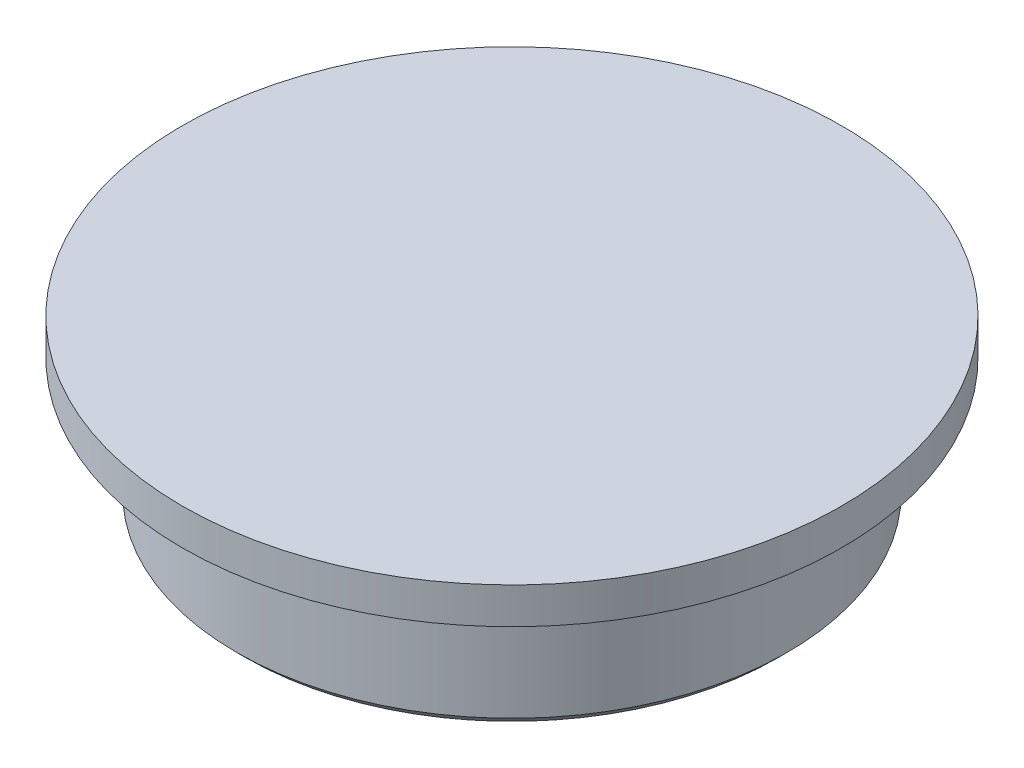
ISO-10303-21;
HEADER;
FILE_DESCRIPTION(('STEP AP214'),'2;1');
FILE_NAME('part.step','',(''),(''),'','','');
FILE_SCHEMA(('AUTOMOTIVE_DESIGN { 1 0 10303 214 1 1 1 1 }'));
ENDSEC;
DATA;
#1=APPLICATION_CONTEXT('core data for automotive mechanical design processes');
#2=APPLICATION_PROTOCOL_DEFINITION('international standard','automotive_design',2000,#1);
#3=PRODUCT_CONTEXT('',#1,'mechanical');
#4=PRODUCT('Part','Part','',(#3));
#5=PRODUCT_RELATED_PRODUCT_CATEGORY('part','',(#4));
#6=PRODUCT_DEFINITION_FORMATION('','',#4);
#7=PRODUCT_DEFINITION_CONTEXT('part definition',#1,'design');
#8=PRODUCT_DEFINITION('design','',#6,#7);
#9=PRODUCT_DEFINITION_SHAPE('','',#8);
#10=(LENGTH_UNIT() NAMED_UNIT(*) SI_UNIT(.MILLI.,.METRE.));
#11=(NAMED_UNIT(*) PLANE_ANGLE_UNIT() SI_UNIT($,.RADIAN.));
#12=(NAMED_UNIT(*) SI_UNIT($,.STERADIAN.) SOLID_ANGLE_UNIT());
#13=UNCERTAINTY_MEASURE_WITH_UNIT(LENGTH_MEASURE(1.E-05),#10,'distance_accuracy_value','');
#14=(GEOMETRIC_REPRESENTATION_CONTEXT(3) GLOBAL_UNCERTAINTY_ASSIGNED_CONTEXT((#13)) GLOBAL_UNIT_ASSIGNED_CONTEXT((#10,
#11,#12)) REPRESENTATION_CONTEXT('',''));
#15=CARTESIAN_POINT('',(0.,0.,0.));
#16=DIRECTION('',(0.,0.,1.));
#17=DIRECTION('',(1.,0.,0.));
#18=AXIS2_PLACEMENT_3D('',#15,#16,#17);
#19=CARTESIAN_POINT('',(0.,7.,0.));
#20=DIRECTION('',(0.,-1.,0.));
#21=DIRECTION('',(0.,0.,-1.));
#22=AXIS2_PLACEMENT_3D('',#19,#20,#21);
#23=CYLINDRICAL_SURFACE('',#22,15.2);
#24=CARTESIAN_POINT('',(0.,0.500000000000004,0.));
#25=DIRECTION('',(0.,1.,0.));
#26=DIRECTION('',(0.,0.,1.));
#27=AXIS2_PLACEMENT_3D('',#24,#25,#26);
#28=CIRCLE('',#27,15.2);
#29=CARTESIAN_POINT('',(0.,0.500000000000004,15.2));
#30=VERTEX_POINT('',#29);
#31=EDGE_CURVE('E68',#30,#30,#28,.T.);
#32=ORIENTED_EDGE('',*,*,#31,.T.);
#33=EDGE_LOOP('',(#32));
#34=FACE_BOUND('',#33,.T.);
#35=CARTESIAN_POINT('',(0.,7.,0.));
#36=DIRECTION('',(0.,1.,0.));
#37=DIRECTION('',(0.,0.,1.));
#38=AXIS2_PLACEMENT_3D('',#35,#36,#37);
#39=CIRCLE('',#38,15.2);
#40=CARTESIAN_POINT('',(0.,7.,15.2));
#41=VERTEX_POINT('',#40);
#42=EDGE_CURVE('E73',#41,#41,#39,.T.);
#43=ORIENTED_EDGE('',*,*,#42,.F.);
#44=EDGE_LOOP('',(#43));
#45=FACE_BOUND('',#44,.T.);
#46=ADVANCED_FACE('F59',(#34,#45),#23,.T.);
#47=CARTESIAN_POINT('',(0.,0.,0.));
#48=DIRECTION('',(0.,1.,0.));
#49=DIRECTION('',(0.,0.,1.));
#50=AXIS2_PLACEMENT_3D('',#47,#48,#49);
#51=PLANE('',#50);
#52=CARTESIAN_POINT('',(0.,0.,0.));
#53=DIRECTION('',(0.,1.,0.));
#54=DIRECTION('',(0.,0.,1.));
#55=AXIS2_PLACEMENT_3D('',#52,#53,#54);
#56=CIRCLE('',#55,14.7);
#57=CARTESIAN_POINT('',(0.,0.,14.7));
#58=VERTEX_POINT('',#57);
#59=EDGE_CURVE('E11',#58,#58,#56,.F.);
#60=ORIENTED_EDGE('',*,*,#59,.T.);
#61=EDGE_LOOP('',(#60));
#62=FACE_BOUND('',#61,.T.);
#63=CARTESIAN_POINT('',(0.,0.,0.));
#64=DIRECTION('',(0.,-1.,0.));
#65=DIRECTION('',(0.,0.,-1.));
#66=AXIS2_PLACEMENT_3D('',#63,#64,#65);
#67=CIRCLE('',#66,13.2);
#68=CARTESIAN_POINT('',(0.,0.,-13.2));
#69=VERTEX_POINT('',#68);
#70=EDGE_CURVE('E89',#69,#69,#67,.T.);
#71=ORIENTED_EDGE('',*,*,#70,.F.);
#72=EDGE_LOOP('',(#71));
#73=FACE_BOUND('',#72,.T.);
#74=ADVANCED_FACE('F106',(#62,#73),#51,.F.);
#75=CARTESIAN_POINT('',(0.,7.,0.));
#76=DIRECTION('',(0.,1.,0.));
#77=DIRECTION('',(0.,0.,1.));
#78=AXIS2_PLACEMENT_3D('',#75,#76,#77);
#79=PLANE('',#78);
#80=ORIENTED_EDGE('',*,*,#42,.T.);
#81=EDGE_LOOP('',(#80));
#82=FACE_BOUND('',#81,.T.);
#83=CARTESIAN_POINT('',(0.,7.,0.));
#84=DIRECTION('',(0.,1.,0.));
#85=DIRECTION('',(0.,0.,1.));
#86=AXIS2_PLACEMENT_3D('',#83,#84,#85);
#87=CIRCLE('',#86,18.2);
#88=CARTESIAN_POINT('',(0.,7.,18.2));
#89=VERTEX_POINT('',#88);
#90=EDGE_CURVE('E81',#89,#89,#87,.T.);
#91=ORIENTED_EDGE('',*,*,#90,.F.);
#92=EDGE_LOOP('',(#91));
#93=FACE_BOUND('',#92,.T.);
#94=ADVANCED_FACE('F108',(#82,#93),#79,.F.);
#95=CARTESIAN_POINT('',(0.,9.,0.));
#96=DIRECTION('',(0.,-1.,0.));
#97=DIRECTION('',(0.,0.,-1.));
#98=AXIS2_PLACEMENT_3D('',#95,#96,#97);
#99=CYLINDRICAL_SURFACE('',#98,18.2);
#100=CARTESIAN_POINT('',(0.,9.,0.));
#101=DIRECTION('',(0.,1.,0.));
#102=DIRECTION('',(0.,0.,1.));
#103=AXIS2_PLACEMENT_3D('',#100,#101,#102);
#104=CIRCLE('',#103,18.2);
#105=CARTESIAN_POINT('',(0.,9.,18.2));
#106=VERTEX_POINT('',#105);
#107=EDGE_CURVE('E78',#106,#106,#104,.T.);
#108=ORIENTED_EDGE('',*,*,#107,.F.);
#109=EDGE_LOOP('',(#108));
#110=FACE_BOUND('',#109,.T.);
#111=ORIENTED_EDGE('',*,*,#90,.T.);
#112=EDGE_LOOP('',(#111));
#113=FACE_BOUND('',#112,.T.);
#114=ADVANCED_FACE('F110',(#110,#113),#99,.T.);
#115=CARTESIAN_POINT('',(0.,9.,0.));
#116=DIRECTION('',(0.,1.,0.));
#117=DIRECTION('',(0.,0.,1.));
#118=AXIS2_PLACEMENT_3D('',#115,#116,#117);
#119=PLANE('',#118);
#120=ORIENTED_EDGE('',*,*,#107,.T.);
#121=EDGE_LOOP('',(#120));
#122=FACE_BOUND('',#121,.T.);
#123=ADVANCED_FACE('F102',(#122),#119,.T.);
#124=CARTESIAN_POINT('',(0.,7.,0.));
#125=DIRECTION('',(0.,-1.,0.));
#126=DIRECTION('',(0.,0.,-1.));
#127=AXIS2_PLACEMENT_3D('',#124,#125,#126);
#128=CYLINDRICAL_SURFACE('',#127,13.2);
#129=CARTESIAN_POINT('',(0.,7.,0.));
#130=DIRECTION('',(0.,-1.,0.));
#131=DIRECTION('',(0.,0.,-1.));
#132=AXIS2_PLACEMENT_3D('',#129,#130,#131);
#133=CIRCLE('',#132,13.2);
#134=CARTESIAN_POINT('',(0.,7.,-13.2));
#135=VERTEX_POINT('',#134);
#136=EDGE_CURVE('E85',#135,#135,#133,.T.);
#137=ORIENTED_EDGE('',*,*,#136,.F.);
#138=EDGE_LOOP('',(#137));
#139=FACE_BOUND('',#138,.T.);
#140=ORIENTED_EDGE('',*,*,#70,.T.);
#141=EDGE_LOOP('',(#140));
#142=FACE_BOUND('',#141,.T.);
#143=ADVANCED_FACE('F99',(#139,#142),#128,.F.);
#144=CARTESIAN_POINT('',(0.,7.,0.));
#145=DIRECTION('',(0.,-1.,0.));
#146=DIRECTION('',(0.,0.,-1.));
#147=AXIS2_PLACEMENT_3D('',#144,#145,#146);
#148=PLANE('',#147);
#149=ORIENTED_EDGE('',*,*,#136,.T.);
#150=EDGE_LOOP('',(#149));
#151=FACE_BOUND('',#150,.T.);
#152=ADVANCED_FACE('F97',(#151),#148,.T.);
#153=CARTESIAN_POINT('',(0.,0.500000000000004,0.));
#154=DIRECTION('',(0.,1.,0.));
#155=DIRECTION('',(0.,0.,1.));
#156=AXIS2_PLACEMENT_3D('',#153,#154,#155);
#157=CONICAL_SURFACE('',#156,15.2,0.785398163397452);
#158=ORIENTED_EDGE('',*,*,#59,.F.);
#159=EDGE_LOOP('',(#158));
#160=FACE_BOUND('',#159,.T.);
#161=ORIENTED_EDGE('',*,*,#31,.F.);
#162=EDGE_LOOP('',(#161));
#163=FACE_BOUND('',#162,.T.);
#164=ADVANCED_FACE('F62',(#160,#163),#157,.T.);
#165=CLOSED_SHELL('',(#46,#74,#94,#114,#123,#143,#152,#164));
#166=MANIFOLD_SOLID_BREP('B2',#165);
#167=ADVANCED_BREP_SHAPE_REPRESENTATION('',(#18,#166),#14);
#168=SHAPE_DEFINITION_REPRESENTATION(#9,#167);
ENDSEC;
END-ISO-10303-21;
